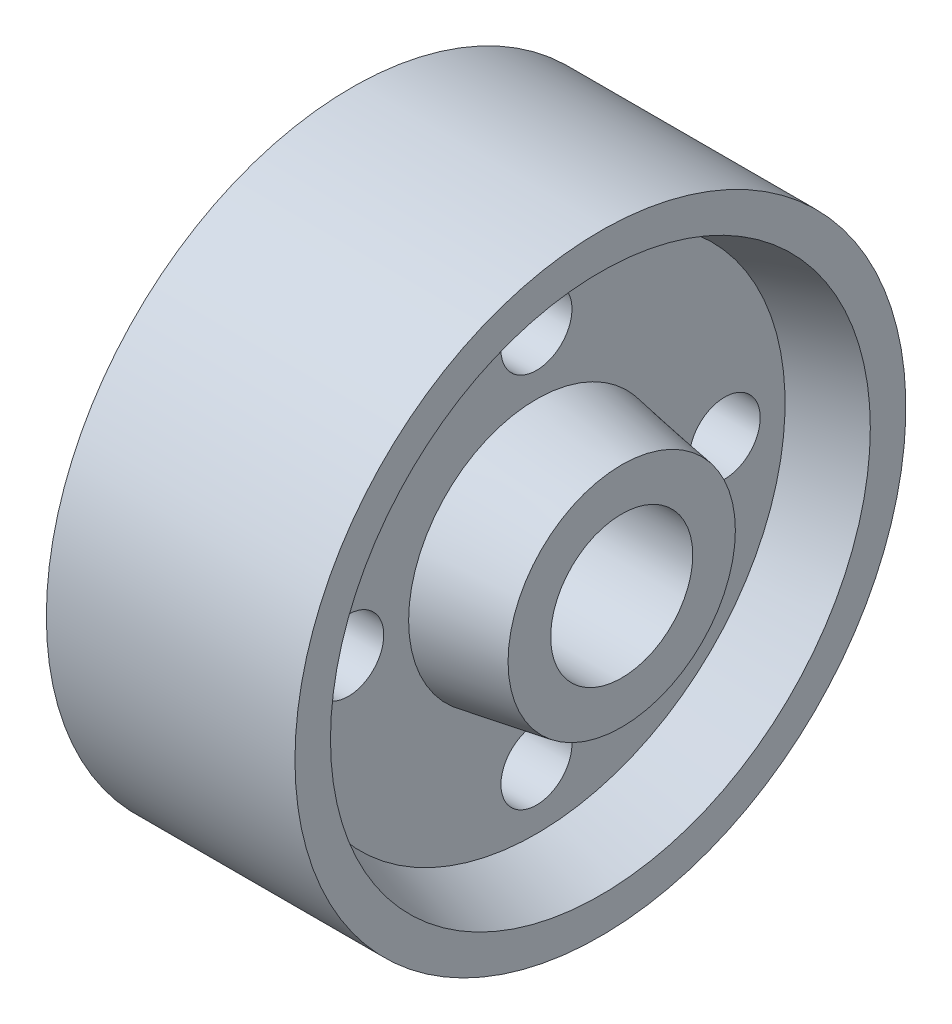
ISO-10303-21;
HEADER;
FILE_DESCRIPTION(('STEP AP214'),'2;1');
FILE_NAME('part.step','',(''),(''),'','','');
FILE_SCHEMA(('AUTOMOTIVE_DESIGN { 1 0 10303 214 1 1 1 1 }'));
ENDSEC;
DATA;
#1=APPLICATION_CONTEXT('core data for automotive mechanical design processes');
#2=APPLICATION_PROTOCOL_DEFINITION('international standard','automotive_design',2000,#1);
#3=PRODUCT_CONTEXT('',#1,'mechanical');
#4=PRODUCT('Part','Part','',(#3));
#5=PRODUCT_RELATED_PRODUCT_CATEGORY('part','',(#4));
#6=PRODUCT_DEFINITION_FORMATION('','',#4);
#7=PRODUCT_DEFINITION_CONTEXT('part definition',#1,'design');
#8=PRODUCT_DEFINITION('design','',#6,#7);
#9=PRODUCT_DEFINITION_SHAPE('','',#8);
#10=(LENGTH_UNIT() NAMED_UNIT(*) SI_UNIT(.MILLI.,.METRE.));
#11=(NAMED_UNIT(*) PLANE_ANGLE_UNIT() SI_UNIT($,.RADIAN.));
#12=(NAMED_UNIT(*) SI_UNIT($,.STERADIAN.) SOLID_ANGLE_UNIT());
#13=UNCERTAINTY_MEASURE_WITH_UNIT(LENGTH_MEASURE(1.E-05),#10,'distance_accuracy_value','');
#14=(GEOMETRIC_REPRESENTATION_CONTEXT(3) GLOBAL_UNCERTAINTY_ASSIGNED_CONTEXT((#13)) GLOBAL_UNIT_ASSIGNED_CONTEXT((#10,
#11,#12)) REPRESENTATION_CONTEXT('',''));
#15=CARTESIAN_POINT('',(0.,0.,0.));
#16=DIRECTION('',(0.,0.,1.));
#17=DIRECTION('',(1.,0.,0.));
#18=AXIS2_PLACEMENT_3D('',#15,#16,#17);
#19=CARTESIAN_POINT('',(41.,0.,0.));
#20=DIRECTION('',(-1.,0.,0.));
#21=DIRECTION('',(0.,0.,1.));
#22=AXIS2_PLACEMENT_3D('',#19,#20,#21);
#23=PLANE('',#22);
#24=CARTESIAN_POINT('',(41.,0.,0.));
#25=DIRECTION('',(1.,0.,0.));
#26=DIRECTION('',(0.,0.,-1.));
#27=AXIS2_PLACEMENT_3D('',#24,#25,#26);
#28=CIRCLE('',#27,10.);
#29=CARTESIAN_POINT('',(41.,0.,-10.));
#30=VERTEX_POINT('',#29);
#31=EDGE_CURVE('E117',#30,#30,#28,.T.);
#32=ORIENTED_EDGE('',*,*,#31,.F.);
#33=EDGE_LOOP('',(#32));
#34=FACE_BOUND('',#33,.T.);
#35=CARTESIAN_POINT('',(41.,0.,0.));
#36=DIRECTION('',(-1.,0.,0.));
#37=DIRECTION('',(0.,0.,1.));
#38=AXIS2_PLACEMENT_3D('',#35,#36,#37);
#39=CIRCLE('',#38,16.);
#40=CARTESIAN_POINT('',(41.,0.,16.));
#41=VERTEX_POINT('',#40);
#42=EDGE_CURVE('E10',#41,#41,#39,.T.);
#43=ORIENTED_EDGE('',*,*,#42,.F.);
#44=EDGE_LOOP('',(#43));
#45=FACE_BOUND('',#44,.T.);
#46=ADVANCED_FACE('F37',(#34,#45),#23,.F.);
#47=CARTESIAN_POINT('',(41.,0.,0.));
#48=DIRECTION('',(-1.,0.,0.));
#49=DIRECTION('',(0.,0.,1.));
#50=AXIS2_PLACEMENT_3D('',#47,#48,#49);
#51=CONICAL_SURFACE('',#50,16.,0.165148677414627);
#52=CARTESIAN_POINT('',(29.,0.,0.));
#53=DIRECTION('',(-1.,0.,0.));
#54=DIRECTION('',(0.,0.,1.));
#55=AXIS2_PLACEMENT_3D('',#52,#53,#54);
#56=CIRCLE('',#55,18.);
#57=CARTESIAN_POINT('',(29.,0.,18.));
#58=VERTEX_POINT('',#57);
#59=EDGE_CURVE('E44',#58,#58,#56,.T.);
#60=ORIENTED_EDGE('',*,*,#59,.F.);
#61=EDGE_LOOP('',(#60));
#62=FACE_BOUND('',#61,.T.);
#63=ORIENTED_EDGE('',*,*,#42,.T.);
#64=EDGE_LOOP('',(#63));
#65=FACE_BOUND('',#64,.T.);
#66=ADVANCED_FACE('F137',(#62,#65),#51,.T.);
#67=CARTESIAN_POINT('',(29.,0.,-18.));
#68=DIRECTION('',(-1.,0.,0.));
#69=DIRECTION('',(0.,0.,1.));
#70=AXIS2_PLACEMENT_3D('',#67,#68,#69);
#71=PLANE('',#70);
#72=CARTESIAN_POINT('',(29.,26.5,0.));
#73=DIRECTION('',(-1.,0.,0.));
#74=DIRECTION('',(0.,0.,1.));
#75=AXIS2_PLACEMENT_3D('',#72,#73,#74);
#76=CIRCLE('',#75,5.);
#77=CARTESIAN_POINT('',(29.,26.5,5.));
#78=VERTEX_POINT('',#77);
#79=EDGE_CURVE('E84',#78,#78,#76,.T.);
#80=ORIENTED_EDGE('',*,*,#79,.T.);
#81=EDGE_LOOP('',(#80));
#82=FACE_BOUND('',#81,.T.);
#83=CARTESIAN_POINT('',(29.,7.48307328879096E-13,26.5000000000007));
#84=DIRECTION('',(-1.,0.,0.));
#85=DIRECTION('',(0.,0.,1.));
#86=AXIS2_PLACEMENT_3D('',#83,#84,#85);
#87=CIRCLE('',#86,5.00000000000059);
#88=CARTESIAN_POINT('',(29.,7.48307328879096E-13,31.5000000000013));
#89=VERTEX_POINT('',#88);
#90=EDGE_CURVE('E88',#89,#89,#87,.T.);
#91=ORIENTED_EDGE('',*,*,#90,.T.);
#92=EDGE_LOOP('',(#91));
#93=FACE_BOUND('',#92,.T.);
#94=CARTESIAN_POINT('',(29.,-26.5,1.49661465775819E-12));
#95=DIRECTION('',(-1.,0.,0.));
#96=DIRECTION('',(0.,0.,1.));
#97=AXIS2_PLACEMENT_3D('',#94,#95,#96);
#98=CIRCLE('',#97,5.00000000000161);
#99=CARTESIAN_POINT('',(29.,-26.5,5.00000000000311));
#100=VERTEX_POINT('',#99);
#101=EDGE_CURVE('E92',#100,#100,#98,.T.);
#102=ORIENTED_EDGE('',*,*,#101,.T.);
#103=EDGE_LOOP('',(#102));
#104=FACE_BOUND('',#103,.T.);
#105=CARTESIAN_POINT('',(29.,-7.51552642896836E-13,-26.4999999999993));
#106=DIRECTION('',(-1.,0.,0.));
#107=DIRECTION('',(0.,0.,1.));
#108=AXIS2_PLACEMENT_3D('',#105,#106,#107);
#109=CIRCLE('',#108,5.0000000000012);
#110=CARTESIAN_POINT('',(29.,-7.51552642896836E-13,-21.499999999998));
#111=VERTEX_POINT('',#110);
#112=EDGE_CURVE('E96',#111,#111,#109,.T.);
#113=ORIENTED_EDGE('',*,*,#112,.T.);
#114=EDGE_LOOP('',(#113));
#115=FACE_BOUND('',#114,.T.);
#116=CARTESIAN_POINT('',(29.,0.,0.));
#117=DIRECTION('',(-1.,0.,0.));
#118=DIRECTION('',(0.,0.,1.));
#119=AXIS2_PLACEMENT_3D('',#116,#117,#118);
#120=CIRCLE('',#119,35.);
#121=CARTESIAN_POINT('',(29.,0.,35.));
#122=VERTEX_POINT('',#121);
#123=EDGE_CURVE('E49',#122,#122,#120,.T.);
#124=ORIENTED_EDGE('',*,*,#123,.F.);
#125=EDGE_LOOP('',(#124));
#126=FACE_BOUND('',#125,.T.);
#127=ORIENTED_EDGE('',*,*,#59,.T.);
#128=EDGE_LOOP('',(#127));
#129=FACE_BOUND('',#128,.T.);
#130=ADVANCED_FACE('F141',(#82,#93,#104,#115,#126,#129),#71,.F.);
#131=CARTESIAN_POINT('',(29.,0.,0.));
#132=DIRECTION('',(1.,0.,0.));
#133=DIRECTION('',(0.,0.,-1.));
#134=AXIS2_PLACEMENT_3D('',#131,#132,#133);
#135=CONICAL_SURFACE('',#134,35.,0.321750554396642);
#136=CARTESIAN_POINT('',(38.,0.,0.));
#137=DIRECTION('',(-1.,0.,0.));
#138=DIRECTION('',(0.,0.,1.));
#139=AXIS2_PLACEMENT_3D('',#136,#137,#138);
#140=CIRCLE('',#139,38.);
#141=CARTESIAN_POINT('',(38.,0.,38.));
#142=VERTEX_POINT('',#141);
#143=EDGE_CURVE('E54',#142,#142,#140,.T.);
#144=ORIENTED_EDGE('',*,*,#143,.F.);
#145=EDGE_LOOP('',(#144));
#146=FACE_BOUND('',#145,.T.);
#147=ORIENTED_EDGE('',*,*,#123,.T.);
#148=EDGE_LOOP('',(#147));
#149=FACE_BOUND('',#148,.T.);
#150=ADVANCED_FACE('F146',(#146,#149),#135,.F.);
#151=CARTESIAN_POINT('',(38.,0.,-38.));
#152=DIRECTION('',(-1.,0.,0.));
#153=DIRECTION('',(0.,0.,1.));
#154=AXIS2_PLACEMENT_3D('',#151,#152,#153);
#155=PLANE('',#154);
#156=CARTESIAN_POINT('',(38.,0.,0.));
#157=DIRECTION('',(-1.,0.,0.));
#158=DIRECTION('',(0.,0.,1.));
#159=AXIS2_PLACEMENT_3D('',#156,#157,#158);
#160=CIRCLE('',#159,43.);
#161=CARTESIAN_POINT('',(38.,0.,43.));
#162=VERTEX_POINT('',#161);
#163=EDGE_CURVE('E60',#162,#162,#160,.T.);
#164=ORIENTED_EDGE('',*,*,#163,.F.);
#165=EDGE_LOOP('',(#164));
#166=FACE_BOUND('',#165,.T.);
#167=ORIENTED_EDGE('',*,*,#143,.T.);
#168=EDGE_LOOP('',(#167));
#169=FACE_BOUND('',#168,.T.);
#170=ADVANCED_FACE('F152',(#166,#169),#155,.F.);
#171=CARTESIAN_POINT('',(0.,0.,0.));
#172=DIRECTION('',(-1.,0.,0.));
#173=DIRECTION('',(0.,0.,1.));
#174=AXIS2_PLACEMENT_3D('',#171,#172,#173);
#175=CYLINDRICAL_SURFACE('',#174,43.);
#176=CARTESIAN_POINT('',(2.99999999999999,0.,0.));
#177=DIRECTION('',(-1.,0.,0.));
#178=DIRECTION('',(0.,0.,1.));
#179=AXIS2_PLACEMENT_3D('',#176,#177,#178);
#180=CIRCLE('',#179,43.);
#181=CARTESIAN_POINT('',(2.99999999999999,0.,43.));
#182=VERTEX_POINT('',#181);
#183=EDGE_CURVE('E64',#182,#182,#180,.T.);
#184=ORIENTED_EDGE('',*,*,#183,.F.);
#185=EDGE_LOOP('',(#184));
#186=FACE_BOUND('',#185,.T.);
#187=ORIENTED_EDGE('',*,*,#163,.T.);
#188=EDGE_LOOP('',(#187));
#189=FACE_BOUND('',#188,.T.);
#190=ADVANCED_FACE('F156',(#186,#189),#175,.T.);
#191=CARTESIAN_POINT('',(2.99999999999999,0.,-38.));
#192=DIRECTION('',(1.,0.,0.));
#193=DIRECTION('',(0.,0.,-1.));
#194=AXIS2_PLACEMENT_3D('',#191,#192,#193);
#195=PLANE('',#194);
#196=CARTESIAN_POINT('',(2.99999999999999,0.,0.));
#197=DIRECTION('',(-1.,0.,0.));
#198=DIRECTION('',(0.,0.,1.));
#199=AXIS2_PLACEMENT_3D('',#196,#197,#198);
#200=CIRCLE('',#199,38.);
#201=CARTESIAN_POINT('',(2.99999999999999,0.,38.));
#202=VERTEX_POINT('',#201);
#203=EDGE_CURVE('E68',#202,#202,#200,.T.);
#204=ORIENTED_EDGE('',*,*,#203,.F.);
#205=EDGE_LOOP('',(#204));
#206=FACE_BOUND('',#205,.T.);
#207=ORIENTED_EDGE('',*,*,#183,.T.);
#208=EDGE_LOOP('',(#207));
#209=FACE_BOUND('',#208,.T.);
#210=ADVANCED_FACE('F160',(#206,#209),#195,.F.);
#211=CARTESIAN_POINT('',(2.99999999999999,0.,0.));
#212=DIRECTION('',(-1.,0.,0.));
#213=DIRECTION('',(0.,0.,1.));
#214=AXIS2_PLACEMENT_3D('',#211,#212,#213);
#215=CONICAL_SURFACE('',#214,38.,0.321750554396641);
#216=CARTESIAN_POINT('',(12.,0.,0.));
#217=DIRECTION('',(-1.,0.,0.));
#218=DIRECTION('',(0.,0.,1.));
#219=AXIS2_PLACEMENT_3D('',#216,#217,#218);
#220=CIRCLE('',#219,35.);
#221=CARTESIAN_POINT('',(12.,0.,35.));
#222=VERTEX_POINT('',#221);
#223=EDGE_CURVE('E72',#222,#222,#220,.T.);
#224=ORIENTED_EDGE('',*,*,#223,.F.);
#225=EDGE_LOOP('',(#224));
#226=FACE_BOUND('',#225,.T.);
#227=ORIENTED_EDGE('',*,*,#203,.T.);
#228=EDGE_LOOP('',(#227));
#229=FACE_BOUND('',#228,.T.);
#230=ADVANCED_FACE('F164',(#226,#229),#215,.F.);
#231=CARTESIAN_POINT('',(12.,0.,-18.));
#232=DIRECTION('',(1.,0.,0.));
#233=DIRECTION('',(0.,0.,-1.));
#234=AXIS2_PLACEMENT_3D('',#231,#232,#233);
#235=PLANE('',#234);
#236=CARTESIAN_POINT('',(12.,26.5,0.));
#237=DIRECTION('',(-1.,0.,0.));
#238=DIRECTION('',(0.,0.,1.));
#239=AXIS2_PLACEMENT_3D('',#236,#237,#238);
#240=CIRCLE('',#239,5.);
#241=CARTESIAN_POINT('',(12.,26.5,5.));
#242=VERTEX_POINT('',#241);
#243=EDGE_CURVE('E100',#242,#242,#240,.T.);
#244=ORIENTED_EDGE('',*,*,#243,.F.);
#245=EDGE_LOOP('',(#244));
#246=FACE_BOUND('',#245,.T.);
#247=CARTESIAN_POINT('',(12.,7.48307328879096E-13,26.5000000000007));
#248=DIRECTION('',(-1.,0.,0.));
#249=DIRECTION('',(0.,0.,1.));
#250=AXIS2_PLACEMENT_3D('',#247,#248,#249);
#251=CIRCLE('',#250,5.00000000000059);
#252=CARTESIAN_POINT('',(12.,7.48307328879096E-13,31.5000000000013));
#253=VERTEX_POINT('',#252);
#254=EDGE_CURVE('E110',#253,#253,#251,.T.);
#255=ORIENTED_EDGE('',*,*,#254,.F.);
#256=EDGE_LOOP('',(#255));
#257=FACE_BOUND('',#256,.T.);
#258=CARTESIAN_POINT('',(12.,-26.5,1.49661465775819E-12));
#259=DIRECTION('',(-1.,0.,0.));
#260=DIRECTION('',(0.,0.,1.));
#261=AXIS2_PLACEMENT_3D('',#258,#259,#260);
#262=CIRCLE('',#261,5.00000000000161);
#263=CARTESIAN_POINT('',(12.,-26.5,5.00000000000311));
#264=VERTEX_POINT('',#263);
#265=EDGE_CURVE('E105',#264,#264,#262,.T.);
#266=ORIENTED_EDGE('',*,*,#265,.F.);
#267=EDGE_LOOP('',(#266));
#268=FACE_BOUND('',#267,.T.);
#269=CARTESIAN_POINT('',(12.,-7.51552642896836E-13,-26.4999999999993));
#270=DIRECTION('',(-1.,0.,0.));
#271=DIRECTION('',(0.,0.,1.));
#272=AXIS2_PLACEMENT_3D('',#269,#270,#271);
#273=CIRCLE('',#272,5.0000000000012);
#274=CARTESIAN_POINT('',(12.,-7.51552642896836E-13,-21.499999999998));
#275=VERTEX_POINT('',#274);
#276=EDGE_CURVE('E101',#275,#275,#273,.T.);
#277=ORIENTED_EDGE('',*,*,#276,.F.);
#278=EDGE_LOOP('',(#277));
#279=FACE_BOUND('',#278,.T.);
#280=CARTESIAN_POINT('',(12.,0.,0.));
#281=DIRECTION('',(-1.,0.,0.));
#282=DIRECTION('',(0.,0.,1.));
#283=AXIS2_PLACEMENT_3D('',#280,#281,#282);
#284=CIRCLE('',#283,18.);
#285=CARTESIAN_POINT('',(12.,0.,18.));
#286=VERTEX_POINT('',#285);
#287=EDGE_CURVE('E76',#286,#286,#284,.T.);
#288=ORIENTED_EDGE('',*,*,#287,.F.);
#289=EDGE_LOOP('',(#288));
#290=FACE_BOUND('',#289,.T.);
#291=ORIENTED_EDGE('',*,*,#223,.T.);
#292=EDGE_LOOP('',(#291));
#293=FACE_BOUND('',#292,.T.);
#294=ADVANCED_FACE('F168',(#246,#257,#268,#279,#290,#293),#235,.F.);
#295=CARTESIAN_POINT('',(12.,0.,0.));
#296=DIRECTION('',(1.,0.,0.));
#297=DIRECTION('',(0.,0.,-1.));
#298=AXIS2_PLACEMENT_3D('',#295,#296,#297);
#299=CONICAL_SURFACE('',#298,18.,0.165148677414627);
#300=CARTESIAN_POINT('',(0.,0.,0.));
#301=DIRECTION('',(-1.,0.,0.));
#302=DIRECTION('',(0.,0.,1.));
#303=AXIS2_PLACEMENT_3D('',#300,#301,#302);
#304=CIRCLE('',#303,16.);
#305=CARTESIAN_POINT('',(0.,0.,16.));
#306=VERTEX_POINT('',#305);
#307=EDGE_CURVE('E80',#306,#306,#304,.T.);
#308=ORIENTED_EDGE('',*,*,#307,.F.);
#309=EDGE_LOOP('',(#308));
#310=FACE_BOUND('',#309,.T.);
#311=ORIENTED_EDGE('',*,*,#287,.T.);
#312=EDGE_LOOP('',(#311));
#313=FACE_BOUND('',#312,.T.);
#314=ADVANCED_FACE('F172',(#310,#313),#299,.T.);
#315=CARTESIAN_POINT('',(0.,0.,0.));
#316=DIRECTION('',(1.,0.,0.));
#317=DIRECTION('',(0.,0.,-1.));
#318=AXIS2_PLACEMENT_3D('',#315,#316,#317);
#319=PLANE('',#318);
#320=CARTESIAN_POINT('',(0.,0.,0.));
#321=DIRECTION('',(1.,0.,0.));
#322=DIRECTION('',(0.,0.,-1.));
#323=AXIS2_PLACEMENT_3D('',#320,#321,#322);
#324=CIRCLE('',#323,10.);
#325=CARTESIAN_POINT('',(0.,0.,-10.));
#326=VERTEX_POINT('',#325);
#327=EDGE_CURVE('E106',#326,#326,#324,.T.);
#328=ORIENTED_EDGE('',*,*,#327,.T.);
#329=EDGE_LOOP('',(#328));
#330=FACE_BOUND('',#329,.T.);
#331=ORIENTED_EDGE('',*,*,#307,.T.);
#332=EDGE_LOOP('',(#331));
#333=FACE_BOUND('',#332,.T.);
#334=ADVANCED_FACE('F125',(#330,#333),#319,.F.);
#335=CARTESIAN_POINT('',(41.,-7.51552642896836E-13,-26.4999999999993));
#336=DIRECTION('',(-1.,0.,0.));
#337=DIRECTION('',(0.,0.,1.));
#338=AXIS2_PLACEMENT_3D('',#335,#336,#337);
#339=CYLINDRICAL_SURFACE('',#338,5.0000000000012);
#340=CARTESIAN_POINT('',(12.,-7.51552642896836E-13,-21.499999999998));
#341=CARTESIAN_POINT('',(12.1770833333333,-7.51552642896836E-13,-21.499999999998));
#342=CARTESIAN_POINT('',(12.3541666666667,-7.51552642896836E-13,-21.499999999998));
#343=CARTESIAN_POINT('',(12.7083333333333,-7.51552642896836E-13,-21.499999999998));
#344=CARTESIAN_POINT('',(12.8854166666667,-7.51552642896836E-13,-21.499999999998));
#345=CARTESIAN_POINT('',(13.2395833333333,-7.51552642896836E-13,-21.499999999998));
#346=CARTESIAN_POINT('',(13.4166666666667,-7.51552642896836E-13,-21.499999999998));
#347=CARTESIAN_POINT('',(13.7708333333333,-7.51552642896836E-13,-21.499999999998));
#348=CARTESIAN_POINT('',(13.9479166666667,-7.51552642896836E-13,-21.499999999998));
#349=CARTESIAN_POINT('',(14.3020833333333,-7.51552642896836E-13,-21.499999999998));
#350=CARTESIAN_POINT('',(14.4791666666667,-7.51552642896836E-13,-21.499999999998));
#351=CARTESIAN_POINT('',(14.8333333333333,-7.51552642896836E-13,-21.499999999998));
#352=CARTESIAN_POINT('',(15.0104166666667,-7.51552642896836E-13,-21.499999999998));
#353=CARTESIAN_POINT('',(15.3645833333333,-7.51552642896836E-13,-21.499999999998));
#354=CARTESIAN_POINT('',(15.5416666666667,-7.51552642896836E-13,-21.499999999998));
#355=CARTESIAN_POINT('',(15.8958333333333,-7.51552642896836E-13,-21.499999999998));
#356=CARTESIAN_POINT('',(16.0729166666667,-7.51552642896836E-13,-21.499999999998));
#357=CARTESIAN_POINT('',(16.4270833333333,-7.51552642896836E-13,-21.499999999998));
#358=CARTESIAN_POINT('',(16.6041666666667,-7.51552642896836E-13,-21.499999999998));
#359=CARTESIAN_POINT('',(16.9583333333333,-7.51552642896836E-13,-21.499999999998));
#360=CARTESIAN_POINT('',(17.1354166666667,-7.51552642896836E-13,-21.499999999998));
#361=CARTESIAN_POINT('',(17.4895833333333,-7.51552642896836E-13,-21.499999999998));
#362=CARTESIAN_POINT('',(17.6666666666667,-7.51552642896836E-13,-21.499999999998));
#363=CARTESIAN_POINT('',(18.0208333333333,-7.51552642896836E-13,-21.499999999998));
#364=CARTESIAN_POINT('',(18.1979166666667,-7.51552642896836E-13,-21.499999999998));
#365=CARTESIAN_POINT('',(18.5520833333333,-7.51552642896836E-13,-21.499999999998));
#366=CARTESIAN_POINT('',(18.7291666666667,-7.51552642896836E-13,-21.499999999998));
#367=CARTESIAN_POINT('',(19.0833333333333,-7.51552642896836E-13,-21.499999999998));
#368=CARTESIAN_POINT('',(19.2604166666667,-7.51552642896836E-13,-21.499999999998));
#369=CARTESIAN_POINT('',(19.6145833333333,-7.51552642896836E-13,-21.499999999998));
#370=CARTESIAN_POINT('',(19.7916666666667,-7.51552642896836E-13,-21.499999999998));
#371=CARTESIAN_POINT('',(20.1458333333333,-7.51552642896836E-13,-21.499999999998));
#372=CARTESIAN_POINT('',(20.3229166666667,-7.51552642896836E-13,-21.499999999998));
#373=CARTESIAN_POINT('',(20.6770833333333,-7.51552642896836E-13,-21.499999999998));
#374=CARTESIAN_POINT('',(20.8541666666667,-7.51552642896836E-13,-21.499999999998));
#375=CARTESIAN_POINT('',(21.2083333333333,-7.51552642896836E-13,-21.499999999998));
#376=CARTESIAN_POINT('',(21.3854166666667,-7.51552642896836E-13,-21.499999999998));
#377=CARTESIAN_POINT('',(21.7395833333333,-7.51552642896836E-13,-21.499999999998));
#378=CARTESIAN_POINT('',(21.9166666666667,-7.51552642896836E-13,-21.499999999998));
#379=CARTESIAN_POINT('',(22.2708333333333,-7.51552642896836E-13,-21.499999999998));
#380=CARTESIAN_POINT('',(22.4479166666667,-7.51552642896836E-13,-21.499999999998));
#381=CARTESIAN_POINT('',(22.8020833333333,-7.51552642896836E-13,-21.499999999998));
#382=CARTESIAN_POINT('',(22.9791666666667,-7.51552642896836E-13,-21.499999999998));
#383=CARTESIAN_POINT('',(23.3333333333333,-7.51552642896836E-13,-21.499999999998));
#384=CARTESIAN_POINT('',(23.5104166666667,-7.51552642896836E-13,-21.499999999998));
#385=CARTESIAN_POINT('',(23.8645833333333,-7.51552642896836E-13,-21.499999999998));
#386=CARTESIAN_POINT('',(24.0416666666667,-7.51552642896836E-13,-21.499999999998));
#387=CARTESIAN_POINT('',(24.3958333333333,-7.51552642896836E-13,-21.499999999998));
#388=CARTESIAN_POINT('',(24.5729166666667,-7.51552642896836E-13,-21.499999999998));
#389=CARTESIAN_POINT('',(24.9270833333333,-7.51552642896836E-13,-21.499999999998));
#390=CARTESIAN_POINT('',(25.1041666666667,-7.51552642896836E-13,-21.499999999998));
#391=CARTESIAN_POINT('',(25.4583333333333,-7.51552642896836E-13,-21.499999999998));
#392=CARTESIAN_POINT('',(25.6354166666667,-7.51552642896836E-13,-21.499999999998));
#393=CARTESIAN_POINT('',(25.9895833333333,-7.51552642896836E-13,-21.499999999998));
#394=CARTESIAN_POINT('',(26.1666666666667,-7.51552642896836E-13,-21.499999999998));
#395=CARTESIAN_POINT('',(26.5208333333333,-7.51552642896836E-13,-21.499999999998));
#396=CARTESIAN_POINT('',(26.6979166666667,-7.51552642896836E-13,-21.499999999998));
#397=CARTESIAN_POINT('',(27.0520833333333,-7.51552642896836E-13,-21.499999999998));
#398=CARTESIAN_POINT('',(27.2291666666667,-7.51552642896836E-13,-21.499999999998));
#399=CARTESIAN_POINT('',(27.5833333333333,-7.51552642896836E-13,-21.499999999998));
#400=CARTESIAN_POINT('',(27.7604166666667,-7.51552642896836E-13,-21.499999999998));
#401=CARTESIAN_POINT('',(28.1145833333333,-7.51552642896836E-13,-21.499999999998));
#402=CARTESIAN_POINT('',(28.2916666666667,-7.51552642896836E-13,-21.499999999998));
#403=CARTESIAN_POINT('',(28.6458333333333,-7.51552642896836E-13,-21.499999999998));
#404=CARTESIAN_POINT('',(28.8229166666667,-7.51552642896836E-13,-21.499999999998));
#405=CARTESIAN_POINT('',(29.,-7.51552642896836E-13,-21.499999999998));
#406=B_SPLINE_CURVE_WITH_KNOTS('',3,(#340,#341,#342,#343,#344,#345,#346,#347,#348,#349,#350,
#351,#352,#353,#354,#355,#356,#357,#358,#359,#360,#361,#362,#363,#364,#365,#366,#367,#368,#369,
#370,#371,#372,#373,#374,#375,#376,#377,#378,#379,#380,#381,#382,#383,#384,#385,#386,#387,#388,
#389,#390,#391,#392,#393,#394,#395,#396,#397,#398,#399,#400,#401,#402,#403,#404,#405),
.UNSPECIFIED.,.F.,.F.,(4,2,2,2,2,2,2,2,2,2,2,2,2,2,2,2,2,2,2,2,2,2,2,2,2,2,2,2,2,2,2,2,4),(0.,
0.53125,1.0625,1.59375,2.125,2.65625,3.1875,3.71875,4.25,4.78125,5.3125,5.84374999999999,6.375,
6.90625,7.4375,7.96875,8.49999999999999,9.03125,9.56249999999999,10.09375,10.625,11.15625,
11.6875,12.21875,12.75,13.28125,13.8125,14.34375,14.875,15.40625,15.9375,16.46875,17.),.UNSPECIFIED.);
#407=EDGE_CURVE('BSEAM179',#275,#111,#406,.T.);
#408=ORIENTED_EDGE('',*,*,#276,.T.);
#409=ORIENTED_EDGE('',*,*,#112,.F.);
#410=ORIENTED_EDGE('',*,*,#407,.T.);
#411=ORIENTED_EDGE('',*,*,#407,.F.);
#412=EDGE_LOOP('',(#408,#410,#409,#411));
#413=FACE_BOUND('',#412,.T.);
#414=ADVANCED_FACE('F179',(#413),#339,.F.);
#415=CARTESIAN_POINT('',(41.,-26.5,1.49661465775819E-12));
#416=DIRECTION('',(-1.,0.,0.));
#417=DIRECTION('',(0.,0.,1.));
#418=AXIS2_PLACEMENT_3D('',#415,#416,#417);
#419=CYLINDRICAL_SURFACE('',#418,5.00000000000161);
#420=CARTESIAN_POINT('',(12.,-26.5,5.00000000000311));
#421=CARTESIAN_POINT('',(12.1770833333333,-26.5,5.00000000000311));
#422=CARTESIAN_POINT('',(12.3541666666667,-26.5,5.00000000000311));
#423=CARTESIAN_POINT('',(12.7083333333333,-26.5,5.00000000000311));
#424=CARTESIAN_POINT('',(12.8854166666667,-26.5,5.00000000000311));
#425=CARTESIAN_POINT('',(13.2395833333333,-26.5,5.00000000000311));
#426=CARTESIAN_POINT('',(13.4166666666667,-26.5,5.00000000000311));
#427=CARTESIAN_POINT('',(13.7708333333333,-26.5,5.00000000000311));
#428=CARTESIAN_POINT('',(13.9479166666667,-26.5,5.00000000000311));
#429=CARTESIAN_POINT('',(14.3020833333333,-26.5,5.00000000000311));
#430=CARTESIAN_POINT('',(14.4791666666667,-26.5,5.00000000000311));
#431=CARTESIAN_POINT('',(14.8333333333333,-26.5,5.00000000000311));
#432=CARTESIAN_POINT('',(15.0104166666667,-26.5,5.00000000000311));
#433=CARTESIAN_POINT('',(15.3645833333333,-26.5,5.00000000000311));
#434=CARTESIAN_POINT('',(15.5416666666667,-26.5,5.00000000000311));
#435=CARTESIAN_POINT('',(15.8958333333333,-26.5,5.00000000000311));
#436=CARTESIAN_POINT('',(16.0729166666667,-26.5,5.00000000000311));
#437=CARTESIAN_POINT('',(16.4270833333333,-26.5,5.00000000000311));
#438=CARTESIAN_POINT('',(16.6041666666667,-26.5,5.00000000000311));
#439=CARTESIAN_POINT('',(16.9583333333333,-26.5,5.00000000000311));
#440=CARTESIAN_POINT('',(17.1354166666667,-26.5,5.00000000000311));
#441=CARTESIAN_POINT('',(17.4895833333333,-26.5,5.00000000000311));
#442=CARTESIAN_POINT('',(17.6666666666667,-26.5,5.00000000000311));
#443=CARTESIAN_POINT('',(18.0208333333333,-26.5,5.00000000000311));
#444=CARTESIAN_POINT('',(18.1979166666667,-26.5,5.00000000000311));
#445=CARTESIAN_POINT('',(18.5520833333333,-26.5,5.00000000000311));
#446=CARTESIAN_POINT('',(18.7291666666667,-26.5,5.00000000000311));
#447=CARTESIAN_POINT('',(19.0833333333333,-26.5,5.00000000000311));
#448=CARTESIAN_POINT('',(19.2604166666667,-26.5,5.00000000000311));
#449=CARTESIAN_POINT('',(19.6145833333333,-26.5,5.00000000000311));
#450=CARTESIAN_POINT('',(19.7916666666667,-26.5,5.00000000000311));
#451=CARTESIAN_POINT('',(20.1458333333333,-26.5,5.00000000000311));
#452=CARTESIAN_POINT('',(20.3229166666667,-26.5,5.00000000000311));
#453=CARTESIAN_POINT('',(20.6770833333333,-26.5,5.00000000000311));
#454=CARTESIAN_POINT('',(20.8541666666667,-26.5,5.00000000000311));
#455=CARTESIAN_POINT('',(21.2083333333333,-26.5,5.00000000000311));
#456=CARTESIAN_POINT('',(21.3854166666667,-26.5,5.00000000000311));
#457=CARTESIAN_POINT('',(21.7395833333333,-26.5,5.00000000000311));
#458=CARTESIAN_POINT('',(21.9166666666667,-26.5,5.00000000000311));
#459=CARTESIAN_POINT('',(22.2708333333333,-26.5,5.00000000000311));
#460=CARTESIAN_POINT('',(22.4479166666667,-26.5,5.00000000000311));
#461=CARTESIAN_POINT('',(22.8020833333333,-26.5,5.00000000000311));
#462=CARTESIAN_POINT('',(22.9791666666667,-26.5,5.00000000000311));
#463=CARTESIAN_POINT('',(23.3333333333333,-26.5,5.00000000000311));
#464=CARTESIAN_POINT('',(23.5104166666667,-26.5,5.00000000000311));
#465=CARTESIAN_POINT('',(23.8645833333333,-26.5,5.00000000000311));
#466=CARTESIAN_POINT('',(24.0416666666667,-26.5,5.00000000000311));
#467=CARTESIAN_POINT('',(24.3958333333333,-26.5,5.00000000000311));
#468=CARTESIAN_POINT('',(24.5729166666667,-26.5,5.00000000000311));
#469=CARTESIAN_POINT('',(24.9270833333333,-26.5,5.00000000000311));
#470=CARTESIAN_POINT('',(25.1041666666667,-26.5,5.00000000000311));
#471=CARTESIAN_POINT('',(25.4583333333333,-26.5,5.00000000000311));
#472=CARTESIAN_POINT('',(25.6354166666667,-26.5,5.00000000000311));
#473=CARTESIAN_POINT('',(25.9895833333333,-26.5,5.00000000000311));
#474=CARTESIAN_POINT('',(26.1666666666667,-26.5,5.00000000000311));
#475=CARTESIAN_POINT('',(26.5208333333333,-26.5,5.00000000000311));
#476=CARTESIAN_POINT('',(26.6979166666667,-26.5,5.00000000000311));
#477=CARTESIAN_POINT('',(27.0520833333333,-26.5,5.00000000000311));
#478=CARTESIAN_POINT('',(27.2291666666667,-26.5,5.00000000000311));
#479=CARTESIAN_POINT('',(27.5833333333333,-26.5,5.00000000000311));
#480=CARTESIAN_POINT('',(27.7604166666667,-26.5,5.00000000000311));
#481=CARTESIAN_POINT('',(28.1145833333333,-26.5,5.00000000000311));
#482=CARTESIAN_POINT('',(28.2916666666667,-26.5,5.00000000000311));
#483=CARTESIAN_POINT('',(28.6458333333333,-26.5,5.00000000000311));
#484=CARTESIAN_POINT('',(28.8229166666667,-26.5,5.00000000000311));
#485=CARTESIAN_POINT('',(29.,-26.5,5.00000000000311));
#486=B_SPLINE_CURVE_WITH_KNOTS('',3,(#420,#421,#422,#423,#424,#425,#426,#427,#428,#429,#430,
#431,#432,#433,#434,#435,#436,#437,#438,#439,#440,#441,#442,#443,#444,#445,#446,#447,#448,#449,
#450,#451,#452,#453,#454,#455,#456,#457,#458,#459,#460,#461,#462,#463,#464,#465,#466,#467,#468,
#469,#470,#471,#472,#473,#474,#475,#476,#477,#478,#479,#480,#481,#482,#483,#484,#485),
.UNSPECIFIED.,.F.,.F.,(4,2,2,2,2,2,2,2,2,2,2,2,2,2,2,2,2,2,2,2,2,2,2,2,2,2,2,2,2,2,2,2,4),(0.,
0.53125,1.0625,1.59375,2.125,2.65625,3.1875,3.71875,4.25,4.78125,5.3125,5.84374999999999,6.375,
6.90625,7.4375,7.96875,8.49999999999999,9.03125,9.56249999999999,10.09375,10.625,11.15625,
11.6875,12.21875,12.75,13.28125,13.8125,14.34375,14.875,15.40625,15.9375,16.46875,17.),.UNSPECIFIED.);
#487=EDGE_CURVE('BSEAM182',#264,#100,#486,.T.);
#488=ORIENTED_EDGE('',*,*,#265,.T.);
#489=ORIENTED_EDGE('',*,*,#101,.F.);
#490=ORIENTED_EDGE('',*,*,#487,.T.);
#491=ORIENTED_EDGE('',*,*,#487,.F.);
#492=EDGE_LOOP('',(#488,#490,#489,#491));
#493=FACE_BOUND('',#492,.T.);
#494=ADVANCED_FACE('F182',(#493),#419,.F.);
#495=CARTESIAN_POINT('',(41.,7.48307328879096E-13,26.5000000000007));
#496=DIRECTION('',(-1.,0.,0.));
#497=DIRECTION('',(0.,0.,1.));
#498=AXIS2_PLACEMENT_3D('',#495,#496,#497);
#499=CYLINDRICAL_SURFACE('',#498,5.00000000000059);
#500=CARTESIAN_POINT('',(12.,7.48307328879096E-13,31.5000000000013));
#501=CARTESIAN_POINT('',(12.1770833333333,7.48307328879096E-13,31.5000000000013));
#502=CARTESIAN_POINT('',(12.3541666666667,7.48307328879096E-13,31.5000000000013));
#503=CARTESIAN_POINT('',(12.7083333333333,7.48307328879096E-13,31.5000000000013));
#504=CARTESIAN_POINT('',(12.8854166666667,7.48307328879096E-13,31.5000000000013));
#505=CARTESIAN_POINT('',(13.2395833333333,7.48307328879096E-13,31.5000000000013));
#506=CARTESIAN_POINT('',(13.4166666666667,7.48307328879096E-13,31.5000000000013));
#507=CARTESIAN_POINT('',(13.7708333333333,7.48307328879096E-13,31.5000000000013));
#508=CARTESIAN_POINT('',(13.9479166666667,7.48307328879096E-13,31.5000000000013));
#509=CARTESIAN_POINT('',(14.3020833333333,7.48307328879096E-13,31.5000000000013));
#510=CARTESIAN_POINT('',(14.4791666666667,7.48307328879096E-13,31.5000000000013));
#511=CARTESIAN_POINT('',(14.8333333333333,7.48307328879096E-13,31.5000000000013));
#512=CARTESIAN_POINT('',(15.0104166666667,7.48307328879096E-13,31.5000000000013));
#513=CARTESIAN_POINT('',(15.3645833333333,7.48307328879096E-13,31.5000000000013));
#514=CARTESIAN_POINT('',(15.5416666666667,7.48307328879096E-13,31.5000000000013));
#515=CARTESIAN_POINT('',(15.8958333333333,7.48307328879096E-13,31.5000000000013));
#516=CARTESIAN_POINT('',(16.0729166666667,7.48307328879096E-13,31.5000000000013));
#517=CARTESIAN_POINT('',(16.4270833333333,7.48307328879096E-13,31.5000000000013));
#518=CARTESIAN_POINT('',(16.6041666666667,7.48307328879096E-13,31.5000000000013));
#519=CARTESIAN_POINT('',(16.9583333333333,7.48307328879096E-13,31.5000000000013));
#520=CARTESIAN_POINT('',(17.1354166666667,7.48307328879096E-13,31.5000000000013));
#521=CARTESIAN_POINT('',(17.4895833333333,7.48307328879096E-13,31.5000000000013));
#522=CARTESIAN_POINT('',(17.6666666666667,7.48307328879096E-13,31.5000000000013));
#523=CARTESIAN_POINT('',(18.0208333333333,7.48307328879096E-13,31.5000000000013));
#524=CARTESIAN_POINT('',(18.1979166666667,7.48307328879096E-13,31.5000000000013));
#525=CARTESIAN_POINT('',(18.5520833333333,7.48307328879096E-13,31.5000000000013));
#526=CARTESIAN_POINT('',(18.7291666666667,7.48307328879096E-13,31.5000000000013));
#527=CARTESIAN_POINT('',(19.0833333333333,7.48307328879096E-13,31.5000000000013));
#528=CARTESIAN_POINT('',(19.2604166666667,7.48307328879096E-13,31.5000000000013));
#529=CARTESIAN_POINT('',(19.6145833333333,7.48307328879096E-13,31.5000000000013));
#530=CARTESIAN_POINT('',(19.7916666666667,7.48307328879096E-13,31.5000000000013));
#531=CARTESIAN_POINT('',(20.1458333333333,7.48307328879096E-13,31.5000000000013));
#532=CARTESIAN_POINT('',(20.3229166666667,7.48307328879096E-13,31.5000000000013));
#533=CARTESIAN_POINT('',(20.6770833333333,7.48307328879096E-13,31.5000000000013));
#534=CARTESIAN_POINT('',(20.8541666666667,7.48307328879096E-13,31.5000000000013));
#535=CARTESIAN_POINT('',(21.2083333333333,7.48307328879096E-13,31.5000000000013));
#536=CARTESIAN_POINT('',(21.3854166666667,7.48307328879096E-13,31.5000000000013));
#537=CARTESIAN_POINT('',(21.7395833333333,7.48307328879096E-13,31.5000000000013));
#538=CARTESIAN_POINT('',(21.9166666666667,7.48307328879096E-13,31.5000000000013));
#539=CARTESIAN_POINT('',(22.2708333333333,7.48307328879096E-13,31.5000000000013));
#540=CARTESIAN_POINT('',(22.4479166666667,7.48307328879096E-13,31.5000000000013));
#541=CARTESIAN_POINT('',(22.8020833333333,7.48307328879096E-13,31.5000000000013));
#542=CARTESIAN_POINT('',(22.9791666666667,7.48307328879096E-13,31.5000000000013));
#543=CARTESIAN_POINT('',(23.3333333333333,7.48307328879096E-13,31.5000000000013));
#544=CARTESIAN_POINT('',(23.5104166666667,7.48307328879096E-13,31.5000000000013));
#545=CARTESIAN_POINT('',(23.8645833333333,7.48307328879096E-13,31.5000000000013));
#546=CARTESIAN_POINT('',(24.0416666666667,7.48307328879096E-13,31.5000000000013));
#547=CARTESIAN_POINT('',(24.3958333333333,7.48307328879096E-13,31.5000000000013));
#548=CARTESIAN_POINT('',(24.5729166666667,7.48307328879096E-13,31.5000000000013));
#549=CARTESIAN_POINT('',(24.9270833333333,7.48307328879096E-13,31.5000000000013));
#550=CARTESIAN_POINT('',(25.1041666666667,7.48307328879096E-13,31.5000000000013));
#551=CARTESIAN_POINT('',(25.4583333333333,7.48307328879096E-13,31.5000000000013));
#552=CARTESIAN_POINT('',(25.6354166666667,7.48307328879096E-13,31.5000000000013));
#553=CARTESIAN_POINT('',(25.9895833333333,7.48307328879096E-13,31.5000000000013));
#554=CARTESIAN_POINT('',(26.1666666666667,7.48307328879096E-13,31.5000000000013));
#555=CARTESIAN_POINT('',(26.5208333333333,7.48307328879096E-13,31.5000000000013));
#556=CARTESIAN_POINT('',(26.6979166666667,7.48307328879096E-13,31.5000000000013));
#557=CARTESIAN_POINT('',(27.0520833333333,7.48307328879096E-13,31.5000000000013));
#558=CARTESIAN_POINT('',(27.2291666666667,7.48307328879096E-13,31.5000000000013));
#559=CARTESIAN_POINT('',(27.5833333333333,7.48307328879096E-13,31.5000000000013));
#560=CARTESIAN_POINT('',(27.7604166666667,7.48307328879096E-13,31.5000000000013));
#561=CARTESIAN_POINT('',(28.1145833333333,7.48307328879096E-13,31.5000000000013));
#562=CARTESIAN_POINT('',(28.2916666666667,7.48307328879096E-13,31.5000000000013));
#563=CARTESIAN_POINT('',(28.6458333333333,7.48307328879096E-13,31.5000000000013));
#564=CARTESIAN_POINT('',(28.8229166666667,7.48307328879096E-13,31.5000000000013));
#565=CARTESIAN_POINT('',(29.,7.48307328879096E-13,31.5000000000013));
#566=B_SPLINE_CURVE_WITH_KNOTS('',3,(#500,#501,#502,#503,#504,#505,#506,#507,#508,#509,#510,
#511,#512,#513,#514,#515,#516,#517,#518,#519,#520,#521,#522,#523,#524,#525,#526,#527,#528,#529,
#530,#531,#532,#533,#534,#535,#536,#537,#538,#539,#540,#541,#542,#543,#544,#545,#546,#547,#548,
#549,#550,#551,#552,#553,#554,#555,#556,#557,#558,#559,#560,#561,#562,#563,#564,#565),
.UNSPECIFIED.,.F.,.F.,(4,2,2,2,2,2,2,2,2,2,2,2,2,2,2,2,2,2,2,2,2,2,2,2,2,2,2,2,2,2,2,2,4),(0.,
0.53125,1.0625,1.59375,2.125,2.65625,3.1875,3.71875,4.25,4.78125,5.3125,5.84374999999999,6.375,
6.90625,7.4375,7.96875,8.49999999999999,9.03125,9.56249999999999,10.09375,10.625,11.15625,
11.6875,12.21875,12.75,13.28125,13.8125,14.34375,14.875,15.40625,15.9375,16.46875,17.),.UNSPECIFIED.);
#567=EDGE_CURVE('BSEAM186',#253,#89,#566,.T.);
#568=ORIENTED_EDGE('',*,*,#254,.T.);
#569=ORIENTED_EDGE('',*,*,#90,.F.);
#570=ORIENTED_EDGE('',*,*,#567,.T.);
#571=ORIENTED_EDGE('',*,*,#567,.F.);
#572=EDGE_LOOP('',(#568,#570,#569,#571));
#573=FACE_BOUND('',#572,.T.);
#574=ADVANCED_FACE('F186',(#573),#499,.F.);
#575=CARTESIAN_POINT('',(41.,26.5,0.));
#576=DIRECTION('',(-1.,0.,0.));
#577=DIRECTION('',(0.,0.,1.));
#578=AXIS2_PLACEMENT_3D('',#575,#576,#577);
#579=CYLINDRICAL_SURFACE('',#578,5.);
#580=CARTESIAN_POINT('',(12.,26.5,5.));
#581=CARTESIAN_POINT('',(12.1770833333333,26.5,5.));
#582=CARTESIAN_POINT('',(12.3541666666667,26.5,5.));
#583=CARTESIAN_POINT('',(12.7083333333333,26.5,5.));
#584=CARTESIAN_POINT('',(12.8854166666667,26.5,5.));
#585=CARTESIAN_POINT('',(13.2395833333333,26.5,5.));
#586=CARTESIAN_POINT('',(13.4166666666667,26.5,5.));
#587=CARTESIAN_POINT('',(13.7708333333333,26.5,5.));
#588=CARTESIAN_POINT('',(13.9479166666667,26.5,5.));
#589=CARTESIAN_POINT('',(14.3020833333333,26.5,5.));
#590=CARTESIAN_POINT('',(14.4791666666667,26.5,5.));
#591=CARTESIAN_POINT('',(14.8333333333333,26.5,5.));
#592=CARTESIAN_POINT('',(15.0104166666667,26.5,5.));
#593=CARTESIAN_POINT('',(15.3645833333333,26.5,5.));
#594=CARTESIAN_POINT('',(15.5416666666667,26.5,5.));
#595=CARTESIAN_POINT('',(15.8958333333333,26.5,5.));
#596=CARTESIAN_POINT('',(16.0729166666667,26.5,5.));
#597=CARTESIAN_POINT('',(16.4270833333333,26.5,5.));
#598=CARTESIAN_POINT('',(16.6041666666667,26.5,5.));
#599=CARTESIAN_POINT('',(16.9583333333333,26.5,5.));
#600=CARTESIAN_POINT('',(17.1354166666667,26.5,5.));
#601=CARTESIAN_POINT('',(17.4895833333333,26.5,5.));
#602=CARTESIAN_POINT('',(17.6666666666667,26.5,5.));
#603=CARTESIAN_POINT('',(18.0208333333333,26.5,5.));
#604=CARTESIAN_POINT('',(18.1979166666667,26.5,5.));
#605=CARTESIAN_POINT('',(18.5520833333333,26.5,5.));
#606=CARTESIAN_POINT('',(18.7291666666667,26.5,5.));
#607=CARTESIAN_POINT('',(19.0833333333333,26.5,5.));
#608=CARTESIAN_POINT('',(19.2604166666667,26.5,5.));
#609=CARTESIAN_POINT('',(19.6145833333333,26.5,5.));
#610=CARTESIAN_POINT('',(19.7916666666667,26.5,5.));
#611=CARTESIAN_POINT('',(20.1458333333333,26.5,5.));
#612=CARTESIAN_POINT('',(20.3229166666667,26.5,5.));
#613=CARTESIAN_POINT('',(20.6770833333333,26.5,5.));
#614=CARTESIAN_POINT('',(20.8541666666667,26.5,5.));
#615=CARTESIAN_POINT('',(21.2083333333333,26.5,5.));
#616=CARTESIAN_POINT('',(21.3854166666667,26.5,5.));
#617=CARTESIAN_POINT('',(21.7395833333333,26.5,5.));
#618=CARTESIAN_POINT('',(21.9166666666667,26.5,5.));
#619=CARTESIAN_POINT('',(22.2708333333333,26.5,5.));
#620=CARTESIAN_POINT('',(22.4479166666667,26.5,5.));
#621=CARTESIAN_POINT('',(22.8020833333333,26.5,5.));
#622=CARTESIAN_POINT('',(22.9791666666667,26.5,5.));
#623=CARTESIAN_POINT('',(23.3333333333333,26.5,5.));
#624=CARTESIAN_POINT('',(23.5104166666667,26.5,5.));
#625=CARTESIAN_POINT('',(23.8645833333333,26.5,5.));
#626=CARTESIAN_POINT('',(24.0416666666667,26.5,5.));
#627=CARTESIAN_POINT('',(24.3958333333333,26.5,5.));
#628=CARTESIAN_POINT('',(24.5729166666667,26.5,5.));
#629=CARTESIAN_POINT('',(24.9270833333333,26.5,5.));
#630=CARTESIAN_POINT('',(25.1041666666667,26.5,5.));
#631=CARTESIAN_POINT('',(25.4583333333333,26.5,5.));
#632=CARTESIAN_POINT('',(25.6354166666667,26.5,5.));
#633=CARTESIAN_POINT('',(25.9895833333333,26.5,5.));
#634=CARTESIAN_POINT('',(26.1666666666667,26.5,5.));
#635=CARTESIAN_POINT('',(26.5208333333333,26.5,5.));
#636=CARTESIAN_POINT('',(26.6979166666667,26.5,5.));
#637=CARTESIAN_POINT('',(27.0520833333333,26.5,5.));
#638=CARTESIAN_POINT('',(27.2291666666667,26.5,5.));
#639=CARTESIAN_POINT('',(27.5833333333333,26.5,5.));
#640=CARTESIAN_POINT('',(27.7604166666667,26.5,5.));
#641=CARTESIAN_POINT('',(28.1145833333333,26.5,5.));
#642=CARTESIAN_POINT('',(28.2916666666667,26.5,5.));
#643=CARTESIAN_POINT('',(28.6458333333333,26.5,5.));
#644=CARTESIAN_POINT('',(28.8229166666667,26.5,5.));
#645=CARTESIAN_POINT('',(29.,26.5,5.));
#646=B_SPLINE_CURVE_WITH_KNOTS('',3,(#580,#581,#582,#583,#584,#585,#586,#587,#588,#589,#590,
#591,#592,#593,#594,#595,#596,#597,#598,#599,#600,#601,#602,#603,#604,#605,#606,#607,#608,#609,
#610,#611,#612,#613,#614,#615,#616,#617,#618,#619,#620,#621,#622,#623,#624,#625,#626,#627,#628,
#629,#630,#631,#632,#633,#634,#635,#636,#637,#638,#639,#640,#641,#642,#643,#644,#645),
.UNSPECIFIED.,.F.,.F.,(4,2,2,2,2,2,2,2,2,2,2,2,2,2,2,2,2,2,2,2,2,2,2,2,2,2,2,2,2,2,2,2,4),(0.,
0.53125,1.0625,1.59375,2.125,2.65625,3.1875,3.71875,4.25,4.78125,5.3125,5.84374999999999,6.375,
6.90625,7.4375,7.96875,8.49999999999999,9.03125,9.56249999999999,10.09375,10.625,11.15625,
11.6875,12.21875,12.75,13.28125,13.8125,14.34375,14.875,15.40625,15.9375,16.46875,17.),.UNSPECIFIED.);
#647=EDGE_CURVE('BSEAM131',#242,#78,#646,.T.);
#648=ORIENTED_EDGE('',*,*,#243,.T.);
#649=ORIENTED_EDGE('',*,*,#79,.F.);
#650=ORIENTED_EDGE('',*,*,#647,.T.);
#651=ORIENTED_EDGE('',*,*,#647,.F.);
#652=EDGE_LOOP('',(#648,#650,#649,#651));
#653=FACE_BOUND('',#652,.T.);
#654=ADVANCED_FACE('F131',(#653),#579,.F.);
#655=CARTESIAN_POINT('',(0.,0.,0.));
#656=DIRECTION('',(1.,0.,0.));
#657=DIRECTION('',(0.,0.,-1.));
#658=AXIS2_PLACEMENT_3D('',#655,#656,#657);
#659=CYLINDRICAL_SURFACE('',#658,10.);
#660=ORIENTED_EDGE('',*,*,#327,.F.);
#661=EDGE_LOOP('',(#660));
#662=FACE_BOUND('',#661,.T.);
#663=ORIENTED_EDGE('',*,*,#31,.T.);
#664=EDGE_LOOP('',(#663));
#665=FACE_BOUND('',#664,.T.);
#666=ADVANCED_FACE('F128',(#662,#665),#659,.F.);
#667=CLOSED_SHELL('',(#46,#66,#130,#150,#170,#190,#210,#230,#294,#314,#334,#414,#494,#574,#654,#666));
#668=MANIFOLD_SOLID_BREP('B2',#667);
#669=ADVANCED_BREP_SHAPE_REPRESENTATION('',(#18,#668),#14);
#670=SHAPE_DEFINITION_REPRESENTATION(#9,#669);
ENDSEC;
END-ISO-10303-21;
